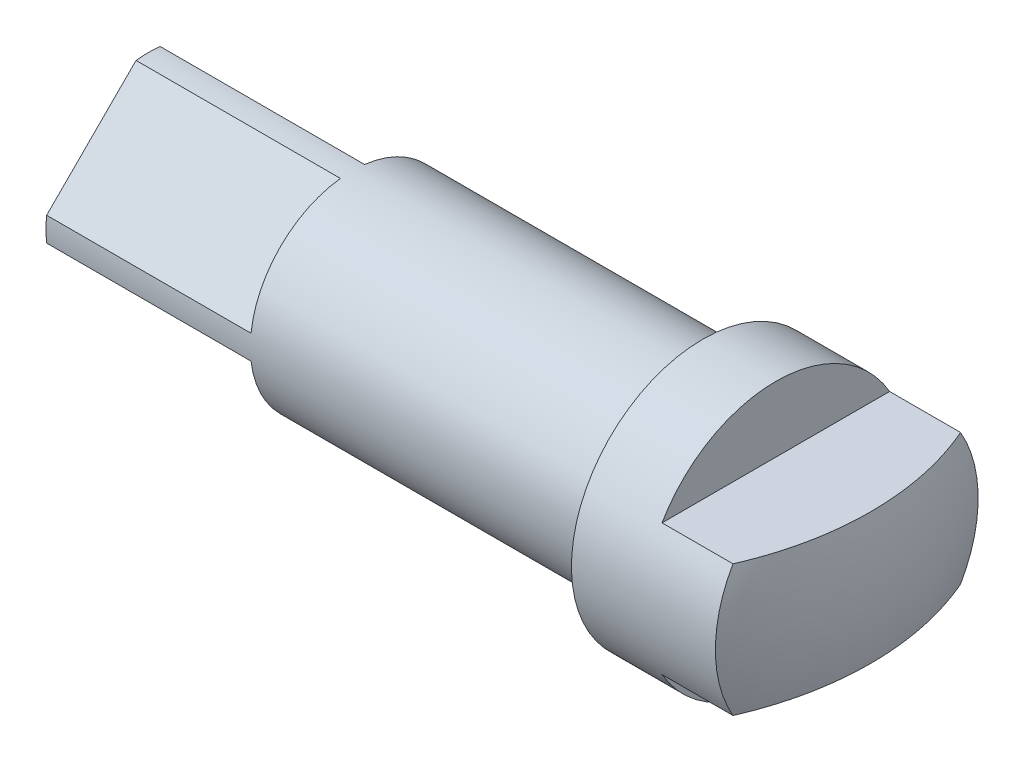
ISO-10303-21;
HEADER;
FILE_DESCRIPTION(('STEP AP214'),'2;1');
FILE_NAME('part.step','',(''),(''),'','','');
FILE_SCHEMA(('AUTOMOTIVE_DESIGN { 1 0 10303 214 1 1 1 1 }'));
ENDSEC;
DATA;
#1=APPLICATION_CONTEXT('core data for automotive mechanical design processes');
#2=APPLICATION_PROTOCOL_DEFINITION('international standard','automotive_design',2000,#1);
#3=PRODUCT_CONTEXT('',#1,'mechanical');
#4=PRODUCT('Part','Part','',(#3));
#5=PRODUCT_RELATED_PRODUCT_CATEGORY('part','',(#4));
#6=PRODUCT_DEFINITION_FORMATION('','',#4);
#7=PRODUCT_DEFINITION_CONTEXT('part definition',#1,'design');
#8=PRODUCT_DEFINITION('design','',#6,#7);
#9=PRODUCT_DEFINITION_SHAPE('','',#8);
#10=(LENGTH_UNIT() NAMED_UNIT(*) SI_UNIT(.MILLI.,.METRE.));
#11=(NAMED_UNIT(*) PLANE_ANGLE_UNIT() SI_UNIT($,.RADIAN.));
#12=(NAMED_UNIT(*) SI_UNIT($,.STERADIAN.) SOLID_ANGLE_UNIT());
#13=UNCERTAINTY_MEASURE_WITH_UNIT(LENGTH_MEASURE(1.E-05),#10,'distance_accuracy_value','');
#14=(GEOMETRIC_REPRESENTATION_CONTEXT(3) GLOBAL_UNCERTAINTY_ASSIGNED_CONTEXT((#13)) GLOBAL_UNIT_ASSIGNED_CONTEXT((#10,
#11,#12)) REPRESENTATION_CONTEXT('',''));
#15=CARTESIAN_POINT('',(0.,0.,0.));
#16=DIRECTION('',(0.,0.,1.));
#17=DIRECTION('',(1.,0.,0.));
#18=AXIS2_PLACEMENT_3D('',#15,#16,#17);
#19=CARTESIAN_POINT('',(30.,0.,0.));
#20=DIRECTION('',(1.,0.,0.));
#21=DIRECTION('',(0.,1.,0.));
#22=AXIS2_PLACEMENT_3D('',#19,#20,#21);
#23=SPHERICAL_SURFACE('',#22,20.);
#24=CARTESIAN_POINT('',(47.8605710994918,0.,0.));
#25=DIRECTION('',(1.,0.,0.));
#26=DIRECTION('',(0.,1.,0.));
#27=AXIS2_PLACEMENT_3D('',#24,#25,#26);
#28=CIRCLE('',#27,9.);
#29=CARTESIAN_POINT('',(47.8605710994918,4.5,7.79422863405995));
#30=VERTEX_POINT('',#29);
#31=CARTESIAN_POINT('',(47.8605710994918,-4.5,7.79422863405995));
#32=VERTEX_POINT('',#31);
#33=EDGE_CURVE('E123',#30,#32,#28,.T.);
#34=ORIENTED_EDGE('',*,*,#33,.T.);
#35=CARTESIAN_POINT('',(30.,-4.5,0.));
#36=DIRECTION('',(0.,-1.,0.));
#37=DIRECTION('',(0.,0.,-1.));
#38=AXIS2_PLACEMENT_3D('',#35,#36,#37);
#39=CIRCLE('',#38,19.4871752699051);
#40=CARTESIAN_POINT('',(47.8605710994918,-4.5,-7.79422863405996));
#41=VERTEX_POINT('',#40);
#42=EDGE_CURVE('E32',#32,#41,#39,.F.);
#43=ORIENTED_EDGE('',*,*,#42,.T.);
#44=CARTESIAN_POINT('',(47.8605710994918,4.5,-7.79422863405996));
#45=VERTEX_POINT('',#44);
#46=EDGE_CURVE('E117',#41,#45,#28,.T.);
#47=ORIENTED_EDGE('',*,*,#46,.T.);
#48=CARTESIAN_POINT('',(30.,4.5,0.));
#49=DIRECTION('',(0.,-1.,0.));
#50=DIRECTION('',(0.,0.,-1.));
#51=AXIS2_PLACEMENT_3D('',#48,#49,#50);
#52=CIRCLE('',#51,19.4871752699051);
#53=EDGE_CURVE('E129',#30,#45,#52,.F.);
#54=ORIENTED_EDGE('',*,*,#53,.F.);
#55=EDGE_LOOP('',(#34,#43,#47,#54));
#56=FACE_BOUND('',#55,.T.);
#57=ADVANCED_FACE('F17',(#56),#23,.T.);
#58=CARTESIAN_POINT('',(50.,0.,0.));
#59=DIRECTION('',(1.,0.,0.));
#60=DIRECTION('',(0.,1.,0.));
#61=AXIS2_PLACEMENT_3D('',#58,#59,#60);
#62=CYLINDRICAL_SURFACE('',#61,9.);
#63=CARTESIAN_POINT('',(38.,0.,0.));
#64=DIRECTION('',(1.,0.,0.));
#65=DIRECTION('',(0.,1.,0.));
#66=AXIS2_PLACEMENT_3D('',#63,#64,#65);
#67=CIRCLE('',#66,9.);
#68=CARTESIAN_POINT('',(38.,9.,0.));
#69=VERTEX_POINT('',#68);
#70=EDGE_CURVE('E124',#69,#69,#67,.T.);
#71=ORIENTED_EDGE('',*,*,#70,.T.);
#72=EDGE_LOOP('',(#71));
#73=FACE_BOUND('',#72,.T.);
#74=ORIENTED_EDGE('',*,*,#46,.F.);
#75=DIRECTION('',(1.,0.,0.));
#76=VECTOR('',#75,1.);
#77=CARTESIAN_POINT('',(50.,-4.5,-7.79422863405995));
#78=LINE('',#77,#76);
#79=CARTESIAN_POINT('',(43.,-4.5,-7.79422863405995));
#80=VERTEX_POINT('',#79);
#81=EDGE_CURVE('E11',#41,#80,#78,.F.);
#82=ORIENTED_EDGE('',*,*,#81,.T.);
#83=CARTESIAN_POINT('',(43.,0.,0.));
#84=DIRECTION('',(1.,0.,0.));
#85=DIRECTION('',(0.,0.,-1.));
#86=AXIS2_PLACEMENT_3D('',#83,#84,#85);
#87=CIRCLE('',#86,9.);
#88=CARTESIAN_POINT('',(43.,-4.5,7.79422863405995));
#89=VERTEX_POINT('',#88);
#90=EDGE_CURVE('E25',#80,#89,#87,.F.);
#91=ORIENTED_EDGE('',*,*,#90,.T.);
#92=DIRECTION('',(1.,0.,0.));
#93=VECTOR('',#92,1.);
#94=CARTESIAN_POINT('',(50.,-4.5,7.79422863405995));
#95=LINE('',#94,#93);
#96=EDGE_CURVE('E111',#89,#32,#95,.T.);
#97=ORIENTED_EDGE('',*,*,#96,.T.);
#98=ORIENTED_EDGE('',*,*,#33,.F.);
#99=DIRECTION('',(1.,0.,0.));
#100=VECTOR('',#99,1.);
#101=CARTESIAN_POINT('',(50.,4.5,7.79422863405995));
#102=LINE('',#101,#100);
#103=CARTESIAN_POINT('',(43.,4.5,7.79422863405995));
#104=VERTEX_POINT('',#103);
#105=EDGE_CURVE('E180',#104,#30,#102,.T.);
#106=ORIENTED_EDGE('',*,*,#105,.F.);
#107=CARTESIAN_POINT('',(43.,0.,0.));
#108=DIRECTION('',(-1.,0.,0.));
#109=DIRECTION('',(0.,0.,1.));
#110=AXIS2_PLACEMENT_3D('',#107,#108,#109);
#111=CIRCLE('',#110,9.);
#112=CARTESIAN_POINT('',(43.,4.5,-7.79422863405995));
#113=VERTEX_POINT('',#112);
#114=EDGE_CURVE('E178',#113,#104,#111,.F.);
#115=ORIENTED_EDGE('',*,*,#114,.F.);
#116=DIRECTION('',(1.,0.,0.));
#117=VECTOR('',#116,1.);
#118=CARTESIAN_POINT('',(50.,4.5,-7.79422863405995));
#119=LINE('',#118,#117);
#120=EDGE_CURVE('E119',#45,#113,#119,.F.);
#121=ORIENTED_EDGE('',*,*,#120,.F.);
#122=EDGE_LOOP('',(#74,#82,#91,#97,#98,#106,#115,#121));
#123=FACE_BOUND('',#122,.T.);
#124=ADVANCED_FACE('F115',(#73,#123),#62,.T.);
#125=CARTESIAN_POINT('',(38.,0.,0.));
#126=DIRECTION('',(-1.,0.,0.));
#127=DIRECTION('',(0.,0.,1.));
#128=AXIS2_PLACEMENT_3D('',#125,#126,#127);
#129=CYLINDRICAL_SURFACE('',#128,7.);
#130=CARTESIAN_POINT('',(38.,0.,0.));
#131=DIRECTION('',(1.,0.,0.));
#132=DIRECTION('',(0.,0.,-1.));
#133=AXIS2_PLACEMENT_3D('',#130,#131,#132);
#134=CIRCLE('',#133,7.);
#135=CARTESIAN_POINT('',(38.,0.,-7.));
#136=VERTEX_POINT('',#135);
#137=EDGE_CURVE('E159',#136,#136,#134,.T.);
#138=ORIENTED_EDGE('',*,*,#137,.F.);
#139=EDGE_LOOP('',(#138));
#140=FACE_BOUND('',#139,.T.);
#141=DIRECTION('',(-1.,0.,0.));
#142=VECTOR('',#141,1.);
#143=CARTESIAN_POINT('',(38.,6.95094947500499,0.827225118047044));
#144=LINE('',#143,#142);
#145=CARTESIAN_POINT('',(14.,6.95094947500498,0.827225118047042));
#146=VERTEX_POINT('',#145);
#147=CARTESIAN_POINT('',(0.,6.95094947500498,0.827225118047043));
#148=VERTEX_POINT('',#147);
#149=EDGE_CURVE('E156',#146,#148,#144,.T.);
#150=ORIENTED_EDGE('',*,*,#149,.F.);
#151=CARTESIAN_POINT('',(14.,0.,0.));
#152=DIRECTION('',(-1.,0.,0.));
#153=DIRECTION('',(0.,0.,1.));
#154=AXIS2_PLACEMENT_3D('',#151,#152,#153);
#155=CIRCLE('',#154,7.);
#156=CARTESIAN_POINT('',(14.,0.827225118047043,6.95094947500498));
#157=VERTEX_POINT('',#156);
#158=EDGE_CURVE('E177',#157,#146,#155,.T.);
#159=ORIENTED_EDGE('',*,*,#158,.F.);
#160=DIRECTION('',(-1.,0.,0.));
#161=VECTOR('',#160,1.);
#162=CARTESIAN_POINT('',(38.,0.827225118047045,6.95094947500499));
#163=LINE('',#162,#161);
#164=CARTESIAN_POINT('',(0.,0.827225118047043,6.95094947500498));
#165=VERTEX_POINT('',#164);
#166=EDGE_CURVE('E154',#165,#157,#163,.F.);
#167=ORIENTED_EDGE('',*,*,#166,.F.);
#168=CARTESIAN_POINT('',(0.,0.,0.));
#169=DIRECTION('',(1.,0.,0.));
#170=DIRECTION('',(0.,0.,-1.));
#171=AXIS2_PLACEMENT_3D('',#168,#169,#170);
#172=CIRCLE('',#171,7.);
#173=CARTESIAN_POINT('',(0.,-0.827225118047044,6.95094947500498));
#174=VERTEX_POINT('',#173);
#175=EDGE_CURVE('E248',#165,#174,#172,.T.);
#176=ORIENTED_EDGE('',*,*,#175,.T.);
#177=DIRECTION('',(-1.,0.,0.));
#178=VECTOR('',#177,1.);
#179=CARTESIAN_POINT('',(38.,-0.827225118047044,6.95094947500498));
#180=LINE('',#179,#178);
#181=CARTESIAN_POINT('',(14.,-0.827225118047043,6.95094947500498));
#182=VERTEX_POINT('',#181);
#183=EDGE_CURVE('E152',#182,#174,#180,.T.);
#184=ORIENTED_EDGE('',*,*,#183,.F.);
#185=CARTESIAN_POINT('',(14.,-6.95094947500498,0.827225118047037));
#186=VERTEX_POINT('',#185);
#187=EDGE_CURVE('E266',#186,#182,#155,.T.);
#188=ORIENTED_EDGE('',*,*,#187,.F.);
#189=DIRECTION('',(-1.,0.,0.));
#190=VECTOR('',#189,1.);
#191=CARTESIAN_POINT('',(38.,-6.95094947500499,0.827225118047038));
#192=LINE('',#191,#190);
#193=CARTESIAN_POINT('',(0.,-6.95094947500498,0.827225118047037));
#194=VERTEX_POINT('',#193);
#195=EDGE_CURVE('E150',#194,#186,#192,.F.);
#196=ORIENTED_EDGE('',*,*,#195,.F.);
#197=CARTESIAN_POINT('',(0.,-6.95094947500499,-0.827225118047035));
#198=VERTEX_POINT('',#197);
#199=EDGE_CURVE('E166',#194,#198,#172,.T.);
#200=ORIENTED_EDGE('',*,*,#199,.T.);
#201=DIRECTION('',(-1.,0.,0.));
#202=VECTOR('',#201,1.);
#203=CARTESIAN_POINT('',(38.,-6.95094947500499,-0.827225118047035));
#204=LINE('',#203,#202);
#205=CARTESIAN_POINT('',(14.,-6.95094947500499,-0.827225118047034));
#206=VERTEX_POINT('',#205);
#207=EDGE_CURVE('E40',#206,#198,#204,.T.);
#208=ORIENTED_EDGE('',*,*,#207,.F.);
#209=CARTESIAN_POINT('',(14.,-0.827225118047035,-6.95094947500499));
#210=VERTEX_POINT('',#209);
#211=EDGE_CURVE('E176',#210,#206,#155,.T.);
#212=ORIENTED_EDGE('',*,*,#211,.F.);
#213=DIRECTION('',(-1.,0.,0.));
#214=VECTOR('',#213,1.);
#215=CARTESIAN_POINT('',(38.,-0.827225118047034,-6.95094947500499));
#216=LINE('',#215,#214);
#217=CARTESIAN_POINT('',(0.,-0.827225118047035,-6.95094947500499));
#218=VERTEX_POINT('',#217);
#219=EDGE_CURVE('E147',#218,#210,#216,.F.);
#220=ORIENTED_EDGE('',*,*,#219,.F.);
#221=CARTESIAN_POINT('',(0.,0.827225118047046,-6.95094947500498));
#222=VERTEX_POINT('',#221);
#223=EDGE_CURVE('E158',#218,#222,#172,.T.);
#224=ORIENTED_EDGE('',*,*,#223,.T.);
#225=DIRECTION('',(-1.,0.,0.));
#226=VECTOR('',#225,1.);
#227=CARTESIAN_POINT('',(38.,0.827225118047046,-6.95094947500498));
#228=LINE('',#227,#226);
#229=CARTESIAN_POINT('',(14.,0.827225118047046,-6.95094947500498));
#230=VERTEX_POINT('',#229);
#231=EDGE_CURVE('E145',#230,#222,#228,.T.);
#232=ORIENTED_EDGE('',*,*,#231,.F.);
#233=CARTESIAN_POINT('',(14.,6.95094947500499,-0.827225118047041));
#234=VERTEX_POINT('',#233);
#235=EDGE_CURVE('E174',#234,#230,#155,.T.);
#236=ORIENTED_EDGE('',*,*,#235,.F.);
#237=DIRECTION('',(-1.,0.,0.));
#238=VECTOR('',#237,1.);
#239=CARTESIAN_POINT('',(38.,6.95094947500498,-0.827225118047041));
#240=LINE('',#239,#238);
#241=CARTESIAN_POINT('',(0.,6.95094947500499,-0.827225118047041));
#242=VERTEX_POINT('',#241);
#243=EDGE_CURVE('E143',#242,#234,#240,.F.);
#244=ORIENTED_EDGE('',*,*,#243,.F.);
#245=EDGE_CURVE('E163',#242,#148,#172,.T.);
#246=ORIENTED_EDGE('',*,*,#245,.T.);
#247=EDGE_LOOP('',(#150,#159,#167,#176,#184,#188,#196,#200,#208,#212,#220,#224,#232,#236,#244,#246));
#248=FACE_BOUND('',#247,.T.);
#249=ADVANCED_FACE('F19',(#140,#248),#129,.T.);
#250=CARTESIAN_POINT('',(0.,0.,0.));
#251=DIRECTION('',(1.,0.,0.));
#252=DIRECTION('',(0.,0.,-1.));
#253=AXIS2_PLACEMENT_3D('',#250,#251,#252);
#254=PLANE('',#253);
#255=DIRECTION('',(0.,-0.707106781186548,0.707106781186548));
#256=VECTOR('',#255,1.);
#257=CARTESIAN_POINT('',(0.,3.88908729652601,3.88908729652601));
#258=LINE('',#257,#256);
#259=EDGE_CURVE('E172',#148,#165,#258,.T.);
#260=ORIENTED_EDGE('',*,*,#259,.F.);
#261=ORIENTED_EDGE('',*,*,#245,.F.);
#262=DIRECTION('',(0.,0.707106781186547,0.707106781186548));
#263=VECTOR('',#262,1.);
#264=CARTESIAN_POINT('',(0.,3.88908729652601,-3.88908729652601));
#265=LINE('',#264,#263);
#266=EDGE_CURVE('E162',#222,#242,#265,.T.);
#267=ORIENTED_EDGE('',*,*,#266,.F.);
#268=ORIENTED_EDGE('',*,*,#223,.F.);
#269=DIRECTION('',(0.,0.707106781186548,-0.707106781186548));
#270=VECTOR('',#269,1.);
#271=CARTESIAN_POINT('',(0.,-3.88908729652601,-3.88908729652601));
#272=LINE('',#271,#270);
#273=EDGE_CURVE('E168',#198,#218,#272,.T.);
#274=ORIENTED_EDGE('',*,*,#273,.F.);
#275=ORIENTED_EDGE('',*,*,#199,.F.);
#276=DIRECTION('',(0.,-0.707106781186547,-0.707106781186548));
#277=VECTOR('',#276,1.);
#278=CARTESIAN_POINT('',(0.,-3.88908729652601,3.88908729652601));
#279=LINE('',#278,#277);
#280=EDGE_CURVE('E170',#174,#194,#279,.T.);
#281=ORIENTED_EDGE('',*,*,#280,.F.);
#282=ORIENTED_EDGE('',*,*,#175,.F.);
#283=EDGE_LOOP('',(#260,#261,#267,#268,#274,#275,#281,#282));
#284=FACE_BOUND('',#283,.T.);
#285=ADVANCED_FACE('F226',(#284),#254,.F.);
#286=CARTESIAN_POINT('',(14.,7.77817459305203,0.));
#287=DIRECTION('',(0.,0.707106781186548,-0.707106781186547));
#288=DIRECTION('',(0.,0.707106781186547,0.707106781186548));
#289=AXIS2_PLACEMENT_3D('',#286,#287,#288);
#290=PLANE('',#289);
#291=ORIENTED_EDGE('',*,*,#231,.T.);
#292=ORIENTED_EDGE('',*,*,#266,.T.);
#293=ORIENTED_EDGE('',*,*,#243,.T.);
#294=DIRECTION('',(0.,-0.707106781186547,-0.707106781186548));
#295=VECTOR('',#294,1.);
#296=CARTESIAN_POINT('',(14.,7.77817459305203,0.));
#297=LINE('',#296,#295);
#298=EDGE_CURVE('E135',#234,#230,#297,.T.);
#299=ORIENTED_EDGE('',*,*,#298,.T.);
#300=EDGE_LOOP('',(#291,#292,#293,#299));
#301=FACE_BOUND('',#300,.T.);
#302=ADVANCED_FACE('F223',(#301),#290,.T.);
#303=CARTESIAN_POINT('',(14.,0.,0.));
#304=DIRECTION('',(-1.,0.,0.));
#305=DIRECTION('',(0.,0.,1.));
#306=AXIS2_PLACEMENT_3D('',#303,#304,#305);
#307=PLANE('',#306);
#308=ORIENTED_EDGE('',*,*,#235,.T.);
#309=ORIENTED_EDGE('',*,*,#298,.F.);
#310=EDGE_LOOP('',(#308,#309));
#311=FACE_BOUND('',#310,.T.);
#312=ADVANCED_FACE('F222',(#311),#307,.T.);
#313=CARTESIAN_POINT('',(14.,0.,-7.77817459305203));
#314=DIRECTION('',(0.,-0.707106781186548,-0.707106781186548));
#315=DIRECTION('',(0.,0.707106781186548,-0.707106781186548));
#316=AXIS2_PLACEMENT_3D('',#313,#314,#315);
#317=PLANE('',#316);
#318=ORIENTED_EDGE('',*,*,#207,.T.);
#319=ORIENTED_EDGE('',*,*,#273,.T.);
#320=ORIENTED_EDGE('',*,*,#219,.T.);
#321=DIRECTION('',(0.,-0.707106781186548,0.707106781186548));
#322=VECTOR('',#321,1.);
#323=CARTESIAN_POINT('',(14.,0.,-7.77817459305203));
#324=LINE('',#323,#322);
#325=EDGE_CURVE('E138',#210,#206,#324,.T.);
#326=ORIENTED_EDGE('',*,*,#325,.T.);
#327=EDGE_LOOP('',(#318,#319,#320,#326));
#328=FACE_BOUND('',#327,.T.);
#329=ADVANCED_FACE('F219',(#328),#317,.T.);
#330=ORIENTED_EDGE('',*,*,#211,.T.);
#331=ORIENTED_EDGE('',*,*,#325,.F.);
#332=EDGE_LOOP('',(#330,#331));
#333=FACE_BOUND('',#332,.T.);
#334=ADVANCED_FACE('F217',(#333),#307,.T.);
#335=CARTESIAN_POINT('',(14.,-7.77817459305202,0.));
#336=DIRECTION('',(0.,-0.707106781186548,0.707106781186547));
#337=DIRECTION('',(0.,-0.707106781186547,-0.707106781186548));
#338=AXIS2_PLACEMENT_3D('',#335,#336,#337);
#339=PLANE('',#338);
#340=ORIENTED_EDGE('',*,*,#183,.T.);
#341=ORIENTED_EDGE('',*,*,#280,.T.);
#342=ORIENTED_EDGE('',*,*,#195,.T.);
#343=DIRECTION('',(0.,0.707106781186547,0.707106781186548));
#344=VECTOR('',#343,1.);
#345=CARTESIAN_POINT('',(14.,-7.77817459305202,0.));
#346=LINE('',#345,#344);
#347=EDGE_CURVE('E140',#186,#182,#346,.T.);
#348=ORIENTED_EDGE('',*,*,#347,.T.);
#349=EDGE_LOOP('',(#340,#341,#342,#348));
#350=FACE_BOUND('',#349,.T.);
#351=ADVANCED_FACE('F213',(#350),#339,.T.);
#352=ORIENTED_EDGE('',*,*,#187,.T.);
#353=ORIENTED_EDGE('',*,*,#347,.F.);
#354=EDGE_LOOP('',(#352,#353));
#355=FACE_BOUND('',#354,.T.);
#356=ADVANCED_FACE('F216',(#355),#307,.T.);
#357=ORIENTED_EDGE('',*,*,#158,.T.);
#358=DIRECTION('',(0.,0.707106781186548,-0.707106781186548));
#359=VECTOR('',#358,1.);
#360=CARTESIAN_POINT('',(14.,0.,7.77817459305203));
#361=LINE('',#360,#359);
#362=EDGE_CURVE('E127',#157,#146,#361,.T.);
#363=ORIENTED_EDGE('',*,*,#362,.F.);
#364=EDGE_LOOP('',(#357,#363));
#365=FACE_BOUND('',#364,.T.);
#366=ADVANCED_FACE('F231',(#365),#307,.T.);
#367=CARTESIAN_POINT('',(14.,0.,7.77817459305203));
#368=DIRECTION('',(0.,0.707106781186548,0.707106781186548));
#369=DIRECTION('',(0.,-0.707106781186548,0.707106781186548));
#370=AXIS2_PLACEMENT_3D('',#367,#368,#369);
#371=PLANE('',#370);
#372=ORIENTED_EDGE('',*,*,#149,.T.);
#373=ORIENTED_EDGE('',*,*,#259,.T.);
#374=ORIENTED_EDGE('',*,*,#166,.T.);
#375=ORIENTED_EDGE('',*,*,#362,.T.);
#376=EDGE_LOOP('',(#372,#373,#374,#375));
#377=FACE_BOUND('',#376,.T.);
#378=ADVANCED_FACE('F228',(#377),#371,.T.);
#379=CARTESIAN_POINT('',(38.,0.,0.));
#380=DIRECTION('',(-1.,0.,0.));
#381=DIRECTION('',(0.,-1.,0.));
#382=AXIS2_PLACEMENT_3D('',#379,#380,#381);
#383=PLANE('',#382);
#384=ORIENTED_EDGE('',*,*,#137,.T.);
#385=EDGE_LOOP('',(#384));
#386=FACE_BOUND('',#385,.T.);
#387=ORIENTED_EDGE('',*,*,#70,.F.);
#388=EDGE_LOOP('',(#387));
#389=FACE_BOUND('',#388,.T.);
#390=ADVANCED_FACE('F202',(#386,#389),#383,.T.);
#391=CARTESIAN_POINT('',(43.,4.5,-9.));
#392=DIRECTION('',(0.,-1.,0.));
#393=DIRECTION('',(0.,0.,-1.));
#394=AXIS2_PLACEMENT_3D('',#391,#392,#393);
#395=PLANE('',#394);
#396=ORIENTED_EDGE('',*,*,#120,.T.);
#397=DIRECTION('',(0.,0.,1.));
#398=VECTOR('',#397,1.);
#399=CARTESIAN_POINT('',(43.,4.5,-9.));
#400=LINE('',#399,#398);
#401=EDGE_CURVE('E186',#113,#104,#400,.T.);
#402=ORIENTED_EDGE('',*,*,#401,.T.);
#403=ORIENTED_EDGE('',*,*,#105,.T.);
#404=ORIENTED_EDGE('',*,*,#53,.T.);
#405=EDGE_LOOP('',(#396,#402,#403,#404));
#406=FACE_BOUND('',#405,.T.);
#407=ADVANCED_FACE('F191',(#406),#395,.F.);
#408=CARTESIAN_POINT('',(43.,9.,-9.));
#409=DIRECTION('',(-1.,0.,0.));
#410=DIRECTION('',(0.,0.,1.));
#411=AXIS2_PLACEMENT_3D('',#408,#409,#410);
#412=PLANE('',#411);
#413=ORIENTED_EDGE('',*,*,#401,.F.);
#414=ORIENTED_EDGE('',*,*,#114,.T.);
#415=EDGE_LOOP('',(#413,#414));
#416=FACE_BOUND('',#415,.T.);
#417=ADVANCED_FACE('F193',(#416),#412,.F.);
#418=CARTESIAN_POINT('',(43.,-9.,-9.));
#419=DIRECTION('',(1.,0.,0.));
#420=DIRECTION('',(0.,0.,-1.));
#421=AXIS2_PLACEMENT_3D('',#418,#419,#420);
#422=PLANE('',#421);
#423=DIRECTION('',(0.,0.,1.));
#424=VECTOR('',#423,1.);
#425=CARTESIAN_POINT('',(43.,-4.5,-9.));
#426=LINE('',#425,#424);
#427=EDGE_CURVE('E109',#80,#89,#426,.T.);
#428=ORIENTED_EDGE('',*,*,#427,.T.);
#429=ORIENTED_EDGE('',*,*,#90,.F.);
#430=EDGE_LOOP('',(#428,#429));
#431=FACE_BOUND('',#430,.T.);
#432=ADVANCED_FACE('F108',(#431),#422,.T.);
#433=CARTESIAN_POINT('',(43.,-4.5,-9.));
#434=DIRECTION('',(0.,-1.,0.));
#435=DIRECTION('',(0.,0.,-1.));
#436=AXIS2_PLACEMENT_3D('',#433,#434,#435);
#437=PLANE('',#436);
#438=ORIENTED_EDGE('',*,*,#42,.F.);
#439=ORIENTED_EDGE('',*,*,#96,.F.);
#440=ORIENTED_EDGE('',*,*,#427,.F.);
#441=ORIENTED_EDGE('',*,*,#81,.F.);
#442=EDGE_LOOP('',(#438,#439,#440,#441));
#443=FACE_BOUND('',#442,.T.);
#444=ADVANCED_FACE('F112',(#443),#437,.T.);
#445=CLOSED_SHELL('',(#57,#124,#249,#285,#302,#312,#329,#334,#351,#356,#366,#378,#390,#407,#417,
#432,#444));
#446=MANIFOLD_SOLID_BREP('B1',#445);
#447=ADVANCED_BREP_SHAPE_REPRESENTATION('',(#18,#446),#14);
#448=SHAPE_DEFINITION_REPRESENTATION(#9,#447);
ENDSEC;
END-ISO-10303-21;
